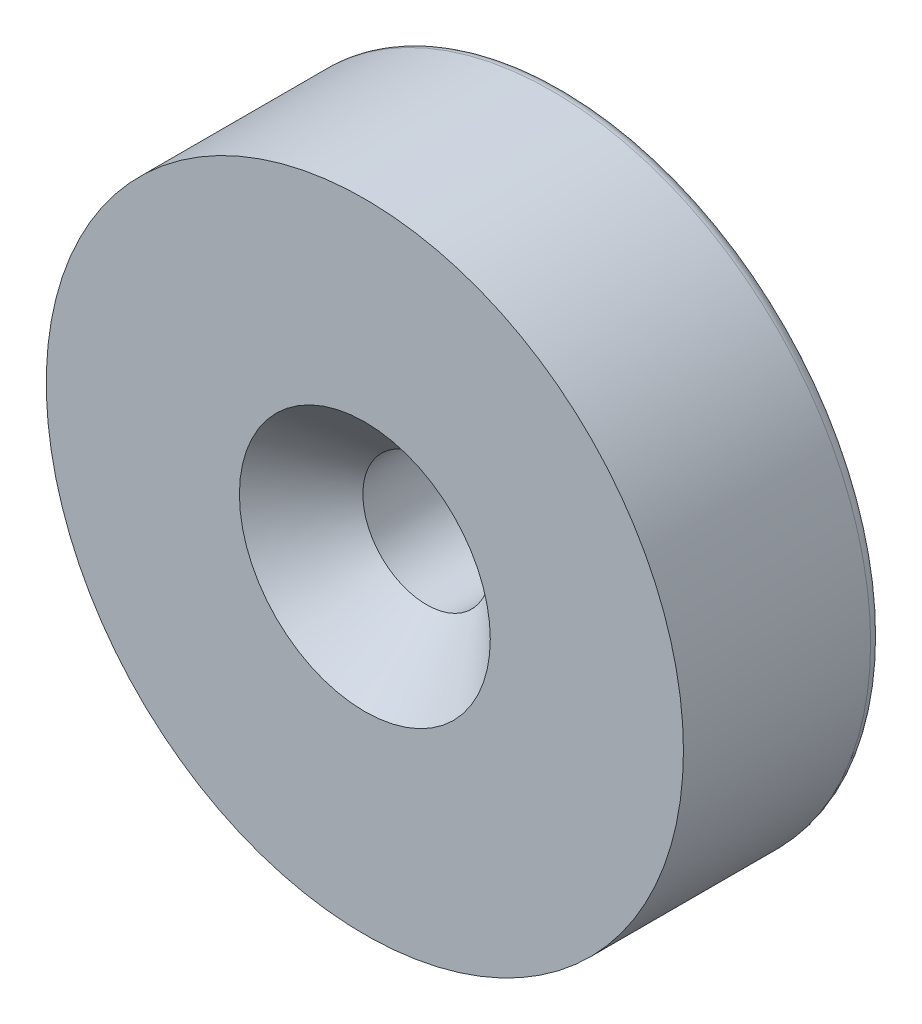
ISO-10303-21;
HEADER;
FILE_DESCRIPTION(('STEP AP214'),'2;1');
FILE_NAME('part.step','',(''),(''),'','','');
FILE_SCHEMA(('AUTOMOTIVE_DESIGN { 1 0 10303 214 1 1 1 1 }'));
ENDSEC;
DATA;
#1=APPLICATION_CONTEXT('core data for automotive mechanical design processes');
#2=APPLICATION_PROTOCOL_DEFINITION('international standard','automotive_design',2000,#1);
#3=PRODUCT_CONTEXT('',#1,'mechanical');
#4=PRODUCT('Part','Part','',(#3));
#5=PRODUCT_RELATED_PRODUCT_CATEGORY('part','',(#4));
#6=PRODUCT_DEFINITION_FORMATION('','',#4);
#7=PRODUCT_DEFINITION_CONTEXT('part definition',#1,'design');
#8=PRODUCT_DEFINITION('design','',#6,#7);
#9=PRODUCT_DEFINITION_SHAPE('','',#8);
#10=(LENGTH_UNIT() NAMED_UNIT(*) SI_UNIT(.MILLI.,.METRE.));
#11=(NAMED_UNIT(*) PLANE_ANGLE_UNIT() SI_UNIT($,.RADIAN.));
#12=(NAMED_UNIT(*) SI_UNIT($,.STERADIAN.) SOLID_ANGLE_UNIT());
#13=UNCERTAINTY_MEASURE_WITH_UNIT(LENGTH_MEASURE(1.E-05),#10,'distance_accuracy_value','');
#14=(GEOMETRIC_REPRESENTATION_CONTEXT(3) GLOBAL_UNCERTAINTY_ASSIGNED_CONTEXT((#13)) GLOBAL_UNIT_ASSIGNED_CONTEXT((#10,
#11,#12)) REPRESENTATION_CONTEXT('',''));
#15=CARTESIAN_POINT('',(0.,0.,0.));
#16=DIRECTION('',(0.,0.,1.));
#17=DIRECTION('',(1.,0.,0.));
#18=AXIS2_PLACEMENT_3D('',#15,#16,#17);
#19=CARTESIAN_POINT('',(0.,0.,5.));
#20=DIRECTION('',(0.,0.,-1.));
#21=DIRECTION('',(-1.,0.,0.));
#22=AXIS2_PLACEMENT_3D('',#19,#20,#21);
#23=CYLINDRICAL_SURFACE('',#22,8.);
#24=CARTESIAN_POINT('',(0.,0.,0.3));
#25=DIRECTION('',(0.,0.,1.));
#26=DIRECTION('',(1.,0.,0.));
#27=AXIS2_PLACEMENT_3D('',#24,#25,#26);
#28=CIRCLE('',#27,8.);
#29=CARTESIAN_POINT('',(8.,0.,0.3));
#30=VERTEX_POINT('',#29);
#31=EDGE_CURVE('E40',#30,#30,#28,.T.);
#32=ORIENTED_EDGE('',*,*,#31,.T.);
#33=EDGE_LOOP('',(#32));
#34=FACE_BOUND('',#33,.T.);
#35=CARTESIAN_POINT('',(0.,0.,5.));
#36=DIRECTION('',(0.,0.,1.));
#37=DIRECTION('',(1.,0.,0.));
#38=AXIS2_PLACEMENT_3D('',#35,#36,#37);
#39=CIRCLE('',#38,8.);
#40=CARTESIAN_POINT('',(8.,0.,5.));
#41=VERTEX_POINT('',#40);
#42=EDGE_CURVE('E44',#41,#41,#39,.T.);
#43=ORIENTED_EDGE('',*,*,#42,.F.);
#44=EDGE_LOOP('',(#43));
#45=FACE_BOUND('',#44,.T.);
#46=ADVANCED_FACE('F33',(#34,#45),#23,.T.);
#47=CARTESIAN_POINT('',(0.,0.,5.));
#48=DIRECTION('',(0.,0.,1.));
#49=DIRECTION('',(1.,0.,0.));
#50=AXIS2_PLACEMENT_3D('',#47,#48,#49);
#51=PLANE('',#50);
#52=CARTESIAN_POINT('',(0.,0.,5.));
#53=DIRECTION('',(0.,0.,1.));
#54=DIRECTION('',(1.,0.,0.));
#55=AXIS2_PLACEMENT_3D('',#52,#53,#54);
#56=CIRCLE('',#55,3.15);
#57=CARTESIAN_POINT('',(3.15,0.,5.));
#58=VERTEX_POINT('',#57);
#59=EDGE_CURVE('E56',#58,#58,#56,.T.);
#60=ORIENTED_EDGE('',*,*,#59,.F.);
#61=EDGE_LOOP('',(#60));
#62=FACE_BOUND('',#61,.T.);
#63=ORIENTED_EDGE('',*,*,#42,.T.);
#64=EDGE_LOOP('',(#63));
#65=FACE_BOUND('',#64,.T.);
#66=ADVANCED_FACE('F62',(#62,#65),#51,.T.);
#67=CARTESIAN_POINT('',(0.,0.,0.));
#68=DIRECTION('',(0.,0.,1.));
#69=DIRECTION('',(1.,0.,0.));
#70=AXIS2_PLACEMENT_3D('',#67,#68,#69);
#71=PLANE('',#70);
#72=CARTESIAN_POINT('',(0.,0.,0.));
#73=DIRECTION('',(0.,0.,1.));
#74=DIRECTION('',(1.,0.,0.));
#75=AXIS2_PLACEMENT_3D('',#72,#73,#74);
#76=CIRCLE('',#75,7.7);
#77=CARTESIAN_POINT('',(7.7,0.,0.));
#78=VERTEX_POINT('',#77);
#79=EDGE_CURVE('E10',#78,#78,#76,.F.);
#80=ORIENTED_EDGE('',*,*,#79,.T.);
#81=EDGE_LOOP('',(#80));
#82=FACE_BOUND('',#81,.T.);
#83=CARTESIAN_POINT('',(0.,0.,0.));
#84=DIRECTION('',(0.,0.,1.));
#85=DIRECTION('',(1.,0.,0.));
#86=AXIS2_PLACEMENT_3D('',#83,#84,#85);
#87=CIRCLE('',#86,1.6);
#88=CARTESIAN_POINT('',(1.6,0.,0.));
#89=VERTEX_POINT('',#88);
#90=EDGE_CURVE('E48',#89,#89,#87,.T.);
#91=ORIENTED_EDGE('',*,*,#90,.T.);
#92=EDGE_LOOP('',(#91));
#93=FACE_BOUND('',#92,.T.);
#94=ADVANCED_FACE('F65',(#82,#93),#71,.F.);
#95=CARTESIAN_POINT('',(0.,0.,5.));
#96=DIRECTION('',(0.,0.,1.));
#97=DIRECTION('',(1.,0.,0.));
#98=AXIS2_PLACEMENT_3D('',#95,#96,#97);
#99=CYLINDRICAL_SURFACE('',#98,1.6);
#100=CARTESIAN_POINT('',(0.,0.,3.45));
#101=DIRECTION('',(0.,0.,1.));
#102=DIRECTION('',(1.,0.,0.));
#103=AXIS2_PLACEMENT_3D('',#100,#101,#102);
#104=CIRCLE('',#103,1.6);
#105=CARTESIAN_POINT('',(1.6,0.,3.45));
#106=VERTEX_POINT('',#105);
#107=EDGE_CURVE('E52',#106,#106,#104,.T.);
#108=ORIENTED_EDGE('',*,*,#107,.T.);
#109=EDGE_LOOP('',(#108));
#110=FACE_BOUND('',#109,.T.);
#111=ORIENTED_EDGE('',*,*,#90,.F.);
#112=EDGE_LOOP('',(#111));
#113=FACE_BOUND('',#112,.T.);
#114=ADVANCED_FACE('F74',(#110,#113),#99,.F.);
#115=CARTESIAN_POINT('',(0.,0.,5.));
#116=DIRECTION('',(0.,0.,1.));
#117=DIRECTION('',(1.,0.,0.));
#118=AXIS2_PLACEMENT_3D('',#115,#116,#117);
#119=CONICAL_SURFACE('',#118,3.15,0.785398163397448);
#120=ORIENTED_EDGE('',*,*,#107,.F.);
#121=EDGE_LOOP('',(#120));
#122=FACE_BOUND('',#121,.T.);
#123=ORIENTED_EDGE('',*,*,#59,.T.);
#124=EDGE_LOOP('',(#123));
#125=FACE_BOUND('',#124,.T.);
#126=ADVANCED_FACE('F60',(#122,#125),#119,.F.);
#127=CARTESIAN_POINT('',(0.,0.,0.3));
#128=DIRECTION('',(0.,0.,1.));
#129=DIRECTION('',(1.,0.,0.));
#130=AXIS2_PLACEMENT_3D('',#127,#128,#129);
#131=TOROIDAL_SURFACE('',#130,7.7,0.3);
#132=ORIENTED_EDGE('',*,*,#79,.F.);
#133=EDGE_LOOP('',(#132));
#134=FACE_BOUND('',#133,.T.);
#135=ORIENTED_EDGE('',*,*,#31,.F.);
#136=EDGE_LOOP('',(#135));
#137=FACE_BOUND('',#136,.T.);
#138=ADVANCED_FACE('F35',(#134,#137),#131,.T.);
#139=CLOSED_SHELL('',(#46,#66,#94,#114,#126,#138));
#140=MANIFOLD_SOLID_BREP('B2',#139);
#141=ADVANCED_BREP_SHAPE_REPRESENTATION('',(#18,#140),#14);
#142=SHAPE_DEFINITION_REPRESENTATION(#9,#141);
ENDSEC;
END-ISO-10303-21;
